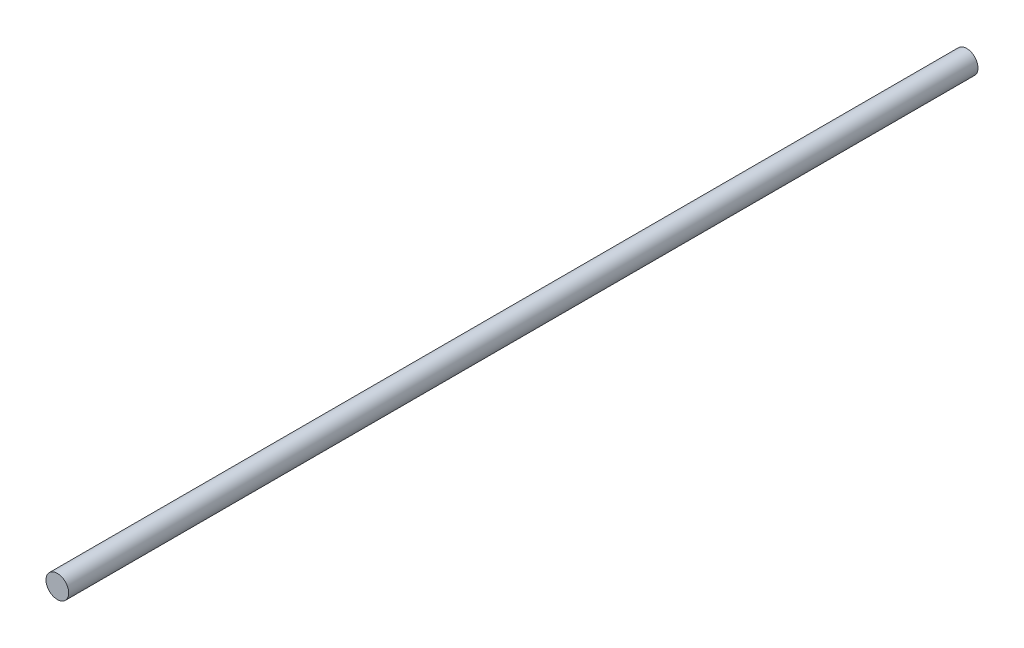
ISO-10303-21;
HEADER;
FILE_DESCRIPTION(('STEP AP214'),'2;1');
FILE_NAME('part.step','',(''),(''),'','','');
FILE_SCHEMA(('AUTOMOTIVE_DESIGN { 1 0 10303 214 1 1 1 1 }'));
ENDSEC;
DATA;
#1=APPLICATION_CONTEXT('core data for automotive mechanical design processes');
#2=APPLICATION_PROTOCOL_DEFINITION('international standard','automotive_design',2000,#1);
#3=PRODUCT_CONTEXT('',#1,'mechanical');
#4=PRODUCT('Part','Part','',(#3));
#5=PRODUCT_RELATED_PRODUCT_CATEGORY('part','',(#4));
#6=PRODUCT_DEFINITION_FORMATION('','',#4);
#7=PRODUCT_DEFINITION_CONTEXT('part definition',#1,'design');
#8=PRODUCT_DEFINITION('design','',#6,#7);
#9=PRODUCT_DEFINITION_SHAPE('','',#8);
#10=(LENGTH_UNIT() NAMED_UNIT(*) SI_UNIT(.MILLI.,.METRE.));
#11=(NAMED_UNIT(*) PLANE_ANGLE_UNIT() SI_UNIT($,.RADIAN.));
#12=(NAMED_UNIT(*) SI_UNIT($,.STERADIAN.) SOLID_ANGLE_UNIT());
#13=UNCERTAINTY_MEASURE_WITH_UNIT(LENGTH_MEASURE(1.E-05),#10,'distance_accuracy_value','');
#14=(GEOMETRIC_REPRESENTATION_CONTEXT(3) GLOBAL_UNCERTAINTY_ASSIGNED_CONTEXT((#13)) GLOBAL_UNIT_ASSIGNED_CONTEXT((#10,
#11,#12)) REPRESENTATION_CONTEXT('',''));
#15=CARTESIAN_POINT('',(0.,0.,0.));
#16=DIRECTION('',(0.,0.,1.));
#17=DIRECTION('',(1.,0.,0.));
#18=AXIS2_PLACEMENT_3D('',#15,#16,#17);
#19=CARTESIAN_POINT('',(0.,0.,480.));
#20=DIRECTION('',(0.,0.,-1.));
#21=DIRECTION('',(-1.,0.,0.));
#22=AXIS2_PLACEMENT_3D('',#19,#20,#21);
#23=CYLINDRICAL_SURFACE('',#22,6.);
#24=CARTESIAN_POINT('',(0.,0.,480.));
#25=DIRECTION('',(0.,0.,1.));
#26=DIRECTION('',(1.,0.,0.));
#27=AXIS2_PLACEMENT_3D('',#24,#25,#26);
#28=CIRCLE('',#27,6.);
#29=CARTESIAN_POINT('',(6.,0.,480.));
#30=VERTEX_POINT('',#29);
#31=EDGE_CURVE('E10',#30,#30,#28,.T.);
#32=ORIENTED_EDGE('',*,*,#31,.F.);
#33=EDGE_LOOP('',(#32));
#34=FACE_BOUND('',#33,.T.);
#35=CARTESIAN_POINT('',(0.,0.,0.));
#36=DIRECTION('',(0.,0.,1.));
#37=DIRECTION('',(1.,0.,0.));
#38=AXIS2_PLACEMENT_3D('',#35,#36,#37);
#39=CIRCLE('',#38,6.);
#40=CARTESIAN_POINT('',(6.,0.,0.));
#41=VERTEX_POINT('',#40);
#42=EDGE_CURVE('E34',#41,#41,#39,.T.);
#43=ORIENTED_EDGE('',*,*,#42,.T.);
#44=EDGE_LOOP('',(#43));
#45=FACE_BOUND('',#44,.T.);
#46=ADVANCED_FACE('F31',(#34,#45),#23,.T.);
#47=CARTESIAN_POINT('',(0.,0.,480.));
#48=DIRECTION('',(0.,0.,1.));
#49=DIRECTION('',(1.,0.,0.));
#50=AXIS2_PLACEMENT_3D('',#47,#48,#49);
#51=PLANE('',#50);
#52=ORIENTED_EDGE('',*,*,#31,.T.);
#53=EDGE_LOOP('',(#52));
#54=FACE_BOUND('',#53,.T.);
#55=ADVANCED_FACE('F46',(#54),#51,.T.);
#56=CARTESIAN_POINT('',(0.,0.,0.));
#57=DIRECTION('',(0.,0.,1.));
#58=DIRECTION('',(1.,0.,0.));
#59=AXIS2_PLACEMENT_3D('',#56,#57,#58);
#60=PLANE('',#59);
#61=ORIENTED_EDGE('',*,*,#42,.F.);
#62=EDGE_LOOP('',(#61));
#63=FACE_BOUND('',#62,.T.);
#64=ADVANCED_FACE('F44',(#63),#60,.F.);
#65=CLOSED_SHELL('',(#46,#55,#64));
#66=MANIFOLD_SOLID_BREP('B2',#65);
#67=ADVANCED_BREP_SHAPE_REPRESENTATION('',(#18,#66),#14);
#68=SHAPE_DEFINITION_REPRESENTATION(#9,#67);
ENDSEC;
END-ISO-10303-21;
